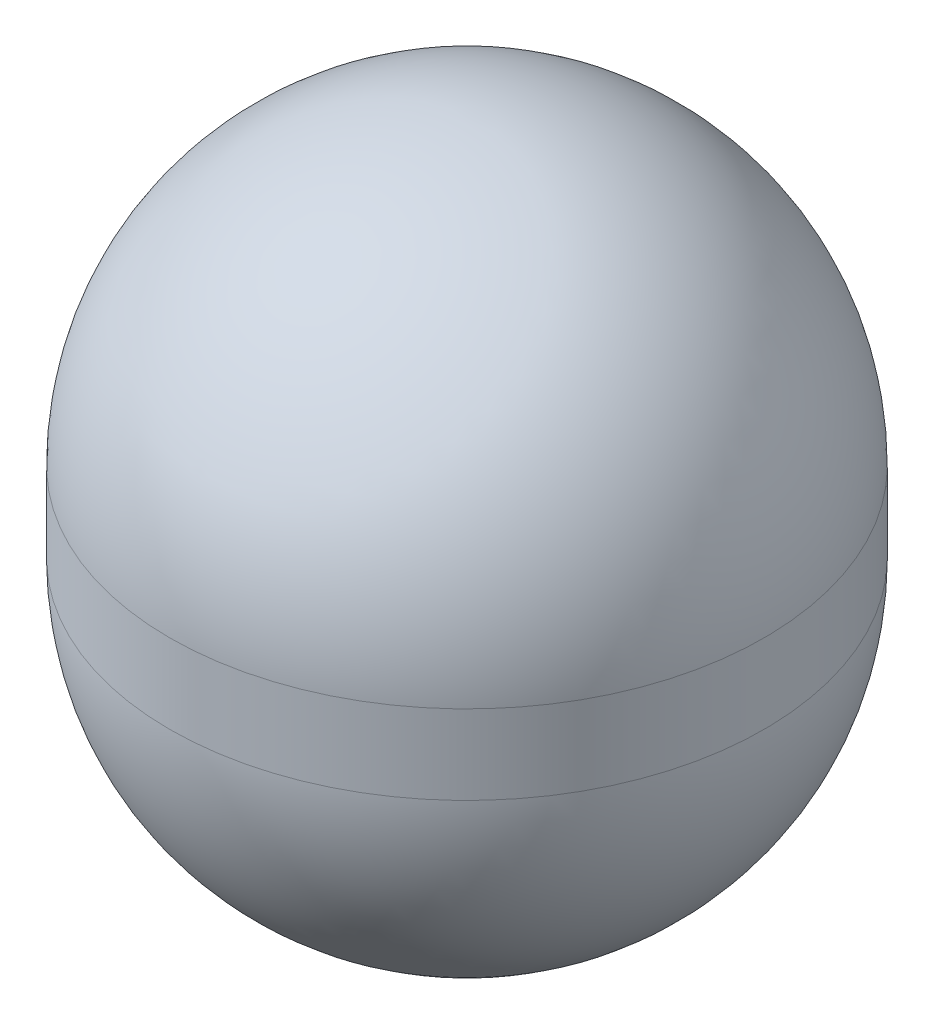
ISO-10303-21;
HEADER;
FILE_DESCRIPTION(('STEP AP214'),'2;1');
FILE_NAME('part.step','',(''),(''),'','','');
FILE_SCHEMA(('AUTOMOTIVE_DESIGN { 1 0 10303 214 1 1 1 1 }'));
ENDSEC;
DATA;
#1=APPLICATION_CONTEXT('core data for automotive mechanical design processes');
#2=APPLICATION_PROTOCOL_DEFINITION('international standard','automotive_design',2000,#1);
#3=PRODUCT_CONTEXT('',#1,'mechanical');
#4=PRODUCT('Part','Part','',(#3));
#5=PRODUCT_RELATED_PRODUCT_CATEGORY('part','',(#4));
#6=PRODUCT_DEFINITION_FORMATION('','',#4);
#7=PRODUCT_DEFINITION_CONTEXT('part definition',#1,'design');
#8=PRODUCT_DEFINITION('design','',#6,#7);
#9=PRODUCT_DEFINITION_SHAPE('','',#8);
#10=(LENGTH_UNIT() NAMED_UNIT(*) SI_UNIT(.MILLI.,.METRE.));
#11=(NAMED_UNIT(*) PLANE_ANGLE_UNIT() SI_UNIT($,.RADIAN.));
#12=(NAMED_UNIT(*) SI_UNIT($,.STERADIAN.) SOLID_ANGLE_UNIT());
#13=UNCERTAINTY_MEASURE_WITH_UNIT(LENGTH_MEASURE(1.E-05),#10,'distance_accuracy_value','');
#14=(GEOMETRIC_REPRESENTATION_CONTEXT(3) GLOBAL_UNCERTAINTY_ASSIGNED_CONTEXT((#13)) GLOBAL_UNIT_ASSIGNED_CONTEXT((#10,
#11,#12)) REPRESENTATION_CONTEXT('',''));
#15=CARTESIAN_POINT('',(0.,0.,0.));
#16=DIRECTION('',(0.,0.,1.));
#17=DIRECTION('',(1.,0.,0.));
#18=AXIS2_PLACEMENT_3D('',#15,#16,#17);
#19=CARTESIAN_POINT('',(-32.1672407583699,30.6052083302099,51.3971434121039));
#20=DIRECTION('',(0.,0.,-1.));
#21=DIRECTION('',(1.,0.,0.));
#22=AXIS2_PLACEMENT_3D('',#19,#20,#21);
#23=SPHERICAL_SURFACE('',#22,19.05);
#24=CARTESIAN_POINT('',(-32.1672407583699,30.6052083302099,51.3971434121039));
#25=DIRECTION('',(0.,1.,0.));
#26=DIRECTION('',(0.,0.,1.));
#27=AXIS2_PLACEMENT_3D('',#24,#25,#26);
#28=SPHERICAL_SURFACE('',#27,19.05);
#29=CARTESIAN_POINT('',(-32.1672407583699,30.6052083302099,51.3971434121039));
#30=DIRECTION('',(0.,1.,0.));
#31=DIRECTION('',(0.,0.,1.));
#32=AXIS2_PLACEMENT_3D('',#29,#30,#31);
#33=CIRCLE('',#32,19.05);
#34=CARTESIAN_POINT('',(-32.1672407583699,30.6052083302099,70.4471434121039));
#35=VERTEX_POINT('',#34);
#36=EDGE_CURVE('P0_E9',#35,#35,#33,.T.);
#37=ORIENTED_EDGE('',*,*,#36,.F.);
#38=EDGE_LOOP('',(#37));
#39=FACE_BOUND('',#38,.T.);
#40=ADVANCED_FACE('P0_F14',(#39),#28,.T.);
#41=CARTESIAN_POINT('',(-32.1672407583699,30.6052083302099,51.3971434121039));
#42=DIRECTION('',(0.,1.,0.));
#43=DIRECTION('',(0.,0.,1.));
#44=AXIS2_PLACEMENT_3D('',#41,#42,#43);
#45=PLANE('',#44);
#46=ORIENTED_EDGE('',*,*,#36,.T.);
#47=EDGE_LOOP('',(#46));
#48=FACE_BOUND('',#47,.T.);
#49=ADVANCED_FACE('P0_F21',(#48),#45,.T.);
#50=CLOSED_SHELL('',(#40,#49));
#51=MANIFOLD_SOLID_BREP('P0_B1',#50);
#52=CARTESIAN_POINT('',(-32.1672407583696,35.6852083302097,51.3971434121039));
#53=DIRECTION('',(0.,-1.,0.));
#54=DIRECTION('',(0.,0.,-1.));
#55=AXIS2_PLACEMENT_3D('',#52,#53,#54);
#56=CYLINDRICAL_SURFACE('',#55,19.05);
#57=CARTESIAN_POINT('',(-32.1672407583696,35.6852083302097,51.3971434121039));
#58=DIRECTION('',(0.,1.,0.));
#59=DIRECTION('',(0.,0.,1.));
#60=AXIS2_PLACEMENT_3D('',#57,#58,#59);
#61=CIRCLE('',#60,19.05);
#62=CARTESIAN_POINT('',(-32.1672407583696,35.6852083302097,70.4471434121039));
#63=VERTEX_POINT('',#62);
#64=EDGE_CURVE('P1_E10',#63,#63,#61,.T.);
#65=ORIENTED_EDGE('',*,*,#64,.F.);
#66=EDGE_LOOP('',(#65));
#67=FACE_BOUND('',#66,.T.);
#68=CARTESIAN_POINT('',(-32.1672407583696,30.6052083302097,51.3971434121039));
#69=DIRECTION('',(0.,1.,0.));
#70=DIRECTION('',(0.,0.,1.));
#71=AXIS2_PLACEMENT_3D('',#68,#69,#70);
#72=CIRCLE('',#71,19.05);
#73=CARTESIAN_POINT('',(-32.1672407583696,30.6052083302097,70.4471434121039));
#74=VERTEX_POINT('',#73);
#75=EDGE_CURVE('P1_E18',#74,#74,#72,.T.);
#76=ORIENTED_EDGE('',*,*,#75,.T.);
#77=EDGE_LOOP('',(#76));
#78=FACE_BOUND('',#77,.T.);
#79=ADVANCED_FACE('P1_F15',(#67,#78),#56,.T.);
#80=CARTESIAN_POINT('',(-32.1672407583696,35.6852083302097,51.3971434121039));
#81=DIRECTION('',(0.,1.,0.));
#82=DIRECTION('',(0.,0.,1.));
#83=AXIS2_PLACEMENT_3D('',#80,#81,#82);
#84=PLANE('',#83);
#85=ORIENTED_EDGE('',*,*,#64,.T.);
#86=EDGE_LOOP('',(#85));
#87=FACE_BOUND('',#86,.T.);
#88=ADVANCED_FACE('P1_F30',(#87),#84,.T.);
#89=CARTESIAN_POINT('',(-32.1672407583696,30.6052083302097,51.3971434121039));
#90=DIRECTION('',(0.,1.,0.));
#91=DIRECTION('',(0.,0.,1.));
#92=AXIS2_PLACEMENT_3D('',#89,#90,#91);
#93=PLANE('',#92);
#94=ORIENTED_EDGE('',*,*,#75,.F.);
#95=EDGE_LOOP('',(#94));
#96=FACE_BOUND('',#95,.T.);
#97=ADVANCED_FACE('P1_F28',(#96),#93,.F.);
#98=CLOSED_SHELL('',(#79,#88,#97));
#99=MANIFOLD_SOLID_BREP('P1_B1',#98);
#100=CARTESIAN_POINT('',(-32.1672407583696,35.6852083302097,51.3971434121039));
#101=DIRECTION('',(0.,0.,-1.));
#102=DIRECTION('',(-1.,0.,0.));
#103=AXIS2_PLACEMENT_3D('',#100,#101,#102);
#104=SPHERICAL_SURFACE('',#103,19.05);
#105=CARTESIAN_POINT('',(-32.1672407583696,35.6852083302097,51.3971434121039));
#106=DIRECTION('',(0.,-1.,0.));
#107=DIRECTION('',(0.,0.,1.));
#108=AXIS2_PLACEMENT_3D('',#105,#106,#107);
#109=SPHERICAL_SURFACE('',#108,19.05);
#110=CARTESIAN_POINT('',(-32.1672407583696,35.6852083302097,51.3971434121039));
#111=DIRECTION('',(0.,-1.,0.));
#112=DIRECTION('',(0.,0.,1.));
#113=AXIS2_PLACEMENT_3D('',#110,#111,#112);
#114=CIRCLE('',#113,19.05);
#115=CARTESIAN_POINT('',(-32.1672407583696,35.6852083302097,70.4471434121039));
#116=VERTEX_POINT('',#115);
#117=EDGE_CURVE('P2_E10',#116,#116,#114,.T.);
#118=ORIENTED_EDGE('',*,*,#117,.F.);
#119=EDGE_LOOP('',(#118));
#120=FACE_BOUND('',#119,.T.);
#121=ADVANCED_FACE('P2_F15',(#120),#109,.T.);
#122=CARTESIAN_POINT('',(-32.1672407583696,35.6852083302097,51.3971434121039));
#123=DIRECTION('',(0.,-1.,0.));
#124=DIRECTION('',(0.,0.,1.));
#125=AXIS2_PLACEMENT_3D('',#122,#123,#124);
#126=PLANE('',#125);
#127=ORIENTED_EDGE('',*,*,#117,.T.);
#128=EDGE_LOOP('',(#127));
#129=FACE_BOUND('',#128,.T.);
#130=ADVANCED_FACE('P2_F22',(#129),#126,.T.);
#131=CLOSED_SHELL('',(#121,#130));
#132=MANIFOLD_SOLID_BREP('P2_B1',#131);
#133=ADVANCED_BREP_SHAPE_REPRESENTATION('',(#18,#51,#99,#132),#14);
#134=SHAPE_DEFINITION_REPRESENTATION(#9,#133);
ENDSEC;
END-ISO-10303-21;
